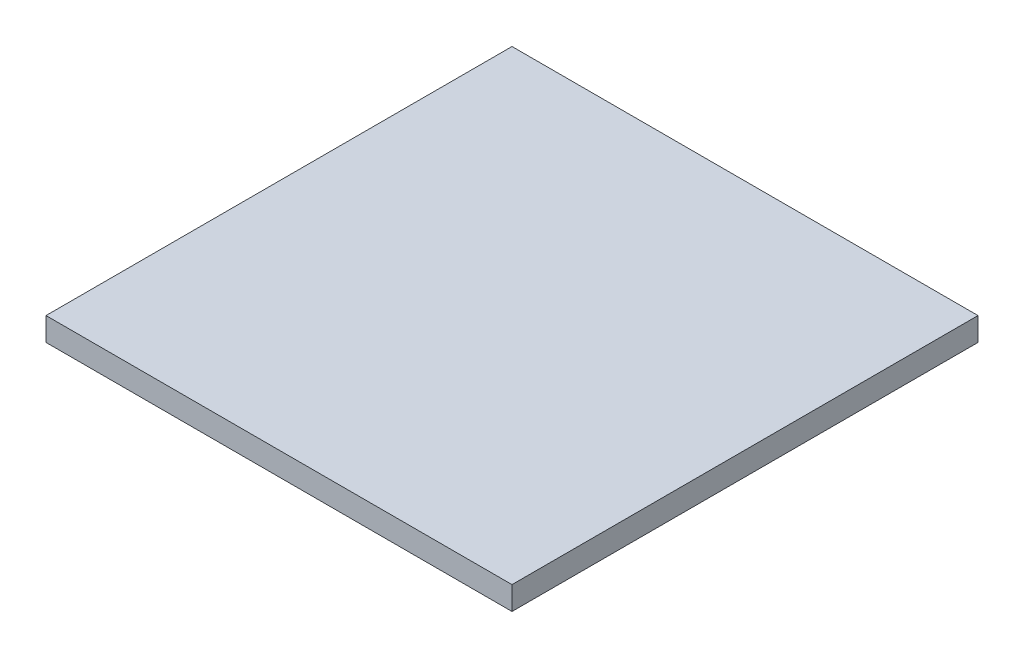
ISO-10303-21;
HEADER;
FILE_DESCRIPTION(('STEP AP214'),'2;1');
FILE_NAME('part.step','',(''),(''),'','','');
FILE_SCHEMA(('AUTOMOTIVE_DESIGN { 1 0 10303 214 1 1 1 1 }'));
ENDSEC;
DATA;
#1=APPLICATION_CONTEXT('core data for automotive mechanical design processes');
#2=APPLICATION_PROTOCOL_DEFINITION('international standard','automotive_design',2000,#1);
#3=PRODUCT_CONTEXT('',#1,'mechanical');
#4=PRODUCT('Part','Part','',(#3));
#5=PRODUCT_RELATED_PRODUCT_CATEGORY('part','',(#4));
#6=PRODUCT_DEFINITION_FORMATION('','',#4);
#7=PRODUCT_DEFINITION_CONTEXT('part definition',#1,'design');
#8=PRODUCT_DEFINITION('design','',#6,#7);
#9=PRODUCT_DEFINITION_SHAPE('','',#8);
#10=(LENGTH_UNIT() NAMED_UNIT(*) SI_UNIT(.MILLI.,.METRE.));
#11=(NAMED_UNIT(*) PLANE_ANGLE_UNIT() SI_UNIT($,.RADIAN.));
#12=(NAMED_UNIT(*) SI_UNIT($,.STERADIAN.) SOLID_ANGLE_UNIT());
#13=UNCERTAINTY_MEASURE_WITH_UNIT(LENGTH_MEASURE(1.E-05),#10,'distance_accuracy_value','');
#14=(GEOMETRIC_REPRESENTATION_CONTEXT(3) GLOBAL_UNCERTAINTY_ASSIGNED_CONTEXT((#13)) GLOBAL_UNIT_ASSIGNED_CONTEXT((#10,
#11,#12)) REPRESENTATION_CONTEXT('',''));
#15=CARTESIAN_POINT('',(0.,0.,0.));
#16=DIRECTION('',(0.,0.,1.));
#17=DIRECTION('',(1.,0.,0.));
#18=AXIS2_PLACEMENT_3D('',#15,#16,#17);
#19=CARTESIAN_POINT('',(0.,300.,0.));
#20=DIRECTION('',(1.,0.,0.));
#21=DIRECTION('',(0.,0.,-1.));
#22=AXIS2_PLACEMENT_3D('',#19,#20,#21);
#23=PLANE('',#22);
#24=DIRECTION('',(0.,0.,1.));
#25=VECTOR('',#24,1.);
#26=CARTESIAN_POINT('',(0.,0.,0.));
#27=LINE('',#26,#25);
#28=CARTESIAN_POINT('',(0.,0.,-6000.));
#29=VERTEX_POINT('',#28);
#30=CARTESIAN_POINT('',(0.,0.,0.));
#31=VERTEX_POINT('',#30);
#32=EDGE_CURVE('E113',#29,#31,#27,.T.);
#33=ORIENTED_EDGE('',*,*,#32,.T.);
#34=DIRECTION('',(0.,-1.,0.));
#35=VECTOR('',#34,1.);
#36=CARTESIAN_POINT('',(0.,300.,0.));
#37=LINE('',#36,#35);
#38=CARTESIAN_POINT('',(0.,300.,0.));
#39=VERTEX_POINT('',#38);
#40=EDGE_CURVE('E11',#39,#31,#37,.T.);
#41=ORIENTED_EDGE('',*,*,#40,.F.);
#42=DIRECTION('',(0.,0.,1.));
#43=VECTOR('',#42,1.);
#44=CARTESIAN_POINT('',(0.,300.,0.));
#45=LINE('',#44,#43);
#46=CARTESIAN_POINT('',(0.,300.,-6000.));
#47=VERTEX_POINT('',#46);
#48=EDGE_CURVE('E97',#47,#39,#45,.T.);
#49=ORIENTED_EDGE('',*,*,#48,.F.);
#50=DIRECTION('',(0.,-1.,0.));
#51=VECTOR('',#50,1.);
#52=CARTESIAN_POINT('',(0.,300.,-6000.));
#53=LINE('',#52,#51);
#54=EDGE_CURVE('E109',#47,#29,#53,.T.);
#55=ORIENTED_EDGE('',*,*,#54,.T.);
#56=EDGE_LOOP('',(#33,#41,#49,#55));
#57=FACE_BOUND('',#56,.T.);
#58=ADVANCED_FACE('F45',(#57),#23,.F.);
#59=CARTESIAN_POINT('',(0.,300.,0.));
#60=DIRECTION('',(0.,0.,-1.));
#61=DIRECTION('',(-1.,0.,0.));
#62=AXIS2_PLACEMENT_3D('',#59,#60,#61);
#63=PLANE('',#62);
#64=DIRECTION('',(1.,0.,0.));
#65=VECTOR('',#64,1.);
#66=CARTESIAN_POINT('',(0.,0.,0.));
#67=LINE('',#66,#65);
#68=CARTESIAN_POINT('',(6000.,0.,0.));
#69=VERTEX_POINT('',#68);
#70=EDGE_CURVE('E102',#31,#69,#67,.T.);
#71=ORIENTED_EDGE('',*,*,#70,.T.);
#72=DIRECTION('',(0.,-1.,0.));
#73=VECTOR('',#72,1.);
#74=CARTESIAN_POINT('',(6000.,300.,0.));
#75=LINE('',#74,#73);
#76=CARTESIAN_POINT('',(6000.,300.,0.));
#77=VERTEX_POINT('',#76);
#78=EDGE_CURVE('E54',#77,#69,#75,.T.);
#79=ORIENTED_EDGE('',*,*,#78,.F.);
#80=DIRECTION('',(1.,0.,0.));
#81=VECTOR('',#80,1.);
#82=CARTESIAN_POINT('',(0.,300.,0.));
#83=LINE('',#82,#81);
#84=EDGE_CURVE('E92',#39,#77,#83,.T.);
#85=ORIENTED_EDGE('',*,*,#84,.F.);
#86=ORIENTED_EDGE('',*,*,#40,.T.);
#87=EDGE_LOOP('',(#71,#79,#85,#86));
#88=FACE_BOUND('',#87,.T.);
#89=ADVANCED_FACE('F101',(#88),#63,.F.);
#90=CARTESIAN_POINT('',(6000.,300.,0.));
#91=DIRECTION('',(-1.,0.,0.));
#92=DIRECTION('',(0.,0.,1.));
#93=AXIS2_PLACEMENT_3D('',#90,#91,#92);
#94=PLANE('',#93);
#95=DIRECTION('',(0.,0.,-1.));
#96=VECTOR('',#95,1.);
#97=CARTESIAN_POINT('',(6000.,0.,0.));
#98=LINE('',#97,#96);
#99=CARTESIAN_POINT('',(6000.,0.,-6000.));
#100=VERTEX_POINT('',#99);
#101=EDGE_CURVE('E79',#69,#100,#98,.T.);
#102=ORIENTED_EDGE('',*,*,#101,.T.);
#103=DIRECTION('',(0.,-1.,0.));
#104=VECTOR('',#103,1.);
#105=CARTESIAN_POINT('',(6000.,300.,-6000.));
#106=LINE('',#105,#104);
#107=CARTESIAN_POINT('',(6000.,300.,-6000.));
#108=VERTEX_POINT('',#107);
#109=EDGE_CURVE('E104',#108,#100,#106,.T.);
#110=ORIENTED_EDGE('',*,*,#109,.F.);
#111=DIRECTION('',(0.,0.,-1.));
#112=VECTOR('',#111,1.);
#113=CARTESIAN_POINT('',(6000.,300.,0.));
#114=LINE('',#113,#112);
#115=EDGE_CURVE('E95',#77,#108,#114,.T.);
#116=ORIENTED_EDGE('',*,*,#115,.F.);
#117=ORIENTED_EDGE('',*,*,#78,.T.);
#118=EDGE_LOOP('',(#102,#110,#116,#117));
#119=FACE_BOUND('',#118,.T.);
#120=ADVANCED_FACE('F105',(#119),#94,.F.);
#121=CARTESIAN_POINT('',(0.,300.,-6000.));
#122=DIRECTION('',(0.,0.,1.));
#123=DIRECTION('',(1.,0.,0.));
#124=AXIS2_PLACEMENT_3D('',#121,#122,#123);
#125=PLANE('',#124);
#126=DIRECTION('',(-1.,0.,0.));
#127=VECTOR('',#126,1.);
#128=CARTESIAN_POINT('',(0.,0.,-6000.));
#129=LINE('',#128,#127);
#130=EDGE_CURVE('E85',#100,#29,#129,.T.);
#131=ORIENTED_EDGE('',*,*,#130,.T.);
#132=ORIENTED_EDGE('',*,*,#54,.F.);
#133=DIRECTION('',(-1.,0.,0.));
#134=VECTOR('',#133,1.);
#135=CARTESIAN_POINT('',(0.,300.,-6000.));
#136=LINE('',#135,#134);
#137=EDGE_CURVE('E62',#108,#47,#136,.T.);
#138=ORIENTED_EDGE('',*,*,#137,.F.);
#139=ORIENTED_EDGE('',*,*,#109,.T.);
#140=EDGE_LOOP('',(#131,#132,#138,#139));
#141=FACE_BOUND('',#140,.T.);
#142=ADVANCED_FACE('F126',(#141),#125,.F.);
#143=CARTESIAN_POINT('',(0.,300.,0.));
#144=DIRECTION('',(0.,-1.,0.));
#145=DIRECTION('',(0.,0.,-1.));
#146=AXIS2_PLACEMENT_3D('',#143,#144,#145);
#147=PLANE('',#146);
#148=ORIENTED_EDGE('',*,*,#48,.T.);
#149=ORIENTED_EDGE('',*,*,#84,.T.);
#150=ORIENTED_EDGE('',*,*,#115,.T.);
#151=ORIENTED_EDGE('',*,*,#137,.T.);
#152=EDGE_LOOP('',(#148,#149,#150,#151));
#153=FACE_BOUND('',#152,.T.);
#154=ADVANCED_FACE('F93',(#153),#147,.F.);
#155=CARTESIAN_POINT('',(0.,0.,0.));
#156=DIRECTION('',(0.,-1.,0.));
#157=DIRECTION('',(0.,0.,-1.));
#158=AXIS2_PLACEMENT_3D('',#155,#156,#157);
#159=PLANE('',#158);
#160=ORIENTED_EDGE('',*,*,#32,.F.);
#161=ORIENTED_EDGE('',*,*,#130,.F.);
#162=ORIENTED_EDGE('',*,*,#101,.F.);
#163=ORIENTED_EDGE('',*,*,#70,.F.);
#164=EDGE_LOOP('',(#160,#161,#162,#163));
#165=FACE_BOUND('',#164,.T.);
#166=ADVANCED_FACE('F129',(#165),#159,.T.);
#167=CLOSED_SHELL('',(#58,#89,#120,#142,#154,#166));
#168=MANIFOLD_SOLID_BREP('B2',#167);
#169=ADVANCED_BREP_SHAPE_REPRESENTATION('',(#18,#168),#14);
#170=SHAPE_DEFINITION_REPRESENTATION(#9,#169);
ENDSEC;
END-ISO-10303-21;
